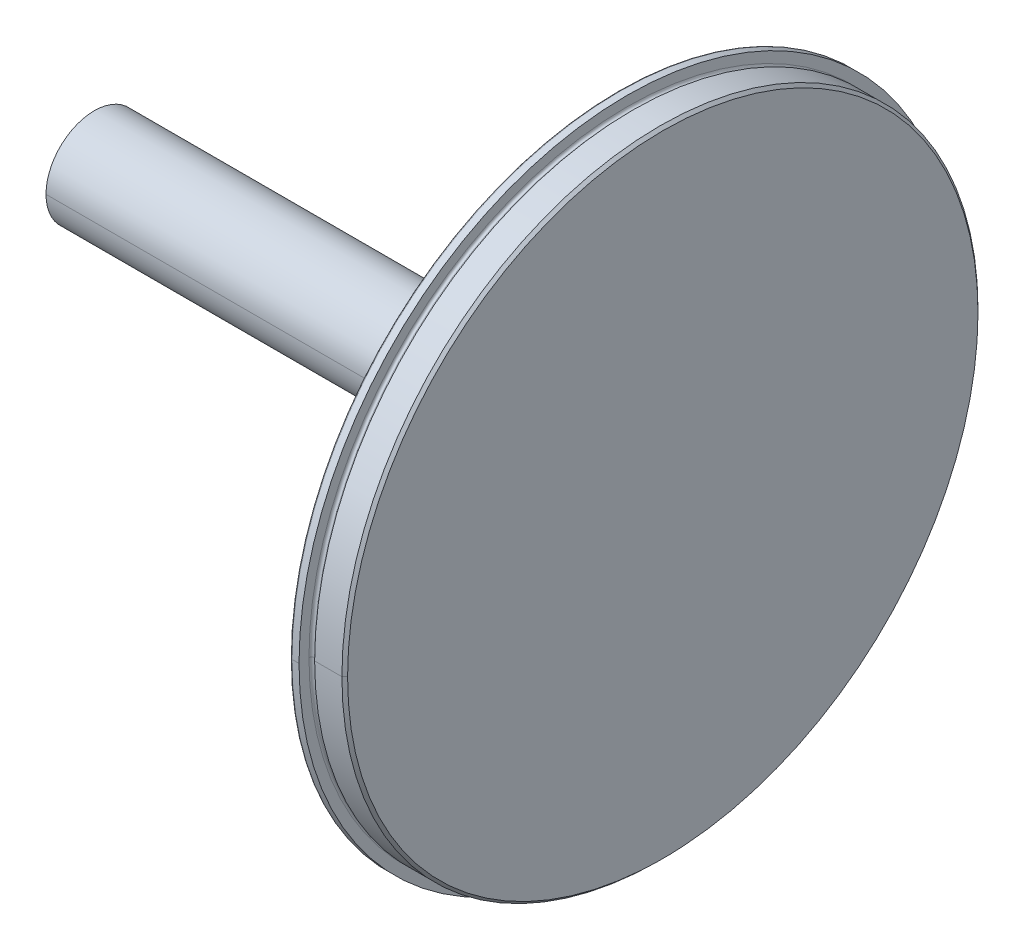
ISO-10303-21;
HEADER;
FILE_DESCRIPTION(('STEP AP214'),'2;1');
FILE_NAME('part.step','',(''),(''),'','','');
FILE_SCHEMA(('AUTOMOTIVE_DESIGN { 1 0 10303 214 1 1 1 1 }'));
ENDSEC;
DATA;
#1=APPLICATION_CONTEXT('core data for automotive mechanical design processes');
#2=APPLICATION_PROTOCOL_DEFINITION('international standard','automotive_design',2000,#1);
#3=PRODUCT_CONTEXT('',#1,'mechanical');
#4=PRODUCT('Part','Part','',(#3));
#5=PRODUCT_RELATED_PRODUCT_CATEGORY('part','',(#4));
#6=PRODUCT_DEFINITION_FORMATION('','',#4);
#7=PRODUCT_DEFINITION_CONTEXT('part definition',#1,'design');
#8=PRODUCT_DEFINITION('design','',#6,#7);
#9=PRODUCT_DEFINITION_SHAPE('','',#8);
#10=(LENGTH_UNIT() NAMED_UNIT(*) SI_UNIT(.MILLI.,.METRE.));
#11=(NAMED_UNIT(*) PLANE_ANGLE_UNIT() SI_UNIT($,.RADIAN.));
#12=(NAMED_UNIT(*) SI_UNIT($,.STERADIAN.) SOLID_ANGLE_UNIT());
#13=UNCERTAINTY_MEASURE_WITH_UNIT(LENGTH_MEASURE(1.E-05),#10,'distance_accuracy_value','');
#14=(GEOMETRIC_REPRESENTATION_CONTEXT(3) GLOBAL_UNCERTAINTY_ASSIGNED_CONTEXT((#13)) GLOBAL_UNIT_ASSIGNED_CONTEXT((#10,
#11,#12)) REPRESENTATION_CONTEXT('',''));
#15=CARTESIAN_POINT('',(0.,0.,0.));
#16=DIRECTION('',(0.,0.,1.));
#17=DIRECTION('',(1.,0.,0.));
#18=AXIS2_PLACEMENT_3D('',#15,#16,#17);
#19=CARTESIAN_POINT('',(-87.6,7.99999999999699,0.));
#20=DIRECTION('',(-1.,0.,0.));
#21=DIRECTION('',(0.,0.,1.));
#22=AXIS2_PLACEMENT_3D('',#19,#20,#21);
#23=PLANE('',#22);
#24=CARTESIAN_POINT('',(-87.6,0.,0.));
#25=DIRECTION('',(1.,0.,0.));
#26=DIRECTION('',(0.,0.,-1.));
#27=AXIS2_PLACEMENT_3D('',#24,#25,#26);
#28=CIRCLE('',#27,8.49999999999725);
#29=CARTESIAN_POINT('',(-87.6,0.,8.49999999999725));
#30=VERTEX_POINT('',#29);
#31=CARTESIAN_POINT('',(-87.6,0.,-8.49999999999725));
#32=VERTEX_POINT('',#31);
#33=EDGE_CURVE('E19',#30,#32,#28,.T.);
#34=ORIENTED_EDGE('',*,*,#33,.F.);
#35=CARTESIAN_POINT('',(-87.6,0.,0.));
#36=DIRECTION('',(1.,0.,0.));
#37=DIRECTION('',(0.,0.,-1.));
#38=AXIS2_PLACEMENT_3D('',#35,#36,#37);
#39=CIRCLE('',#38,8.49999999999725);
#40=EDGE_CURVE('E131',#32,#30,#39,.T.);
#41=ORIENTED_EDGE('',*,*,#40,.F.);
#42=EDGE_LOOP('',(#34,#41));
#43=FACE_BOUND('',#42,.T.);
#44=ADVANCED_FACE('F16',(#43),#23,.T.);
#45=CARTESIAN_POINT('',(0.,0.,0.));
#46=DIRECTION('',(1.,0.,0.));
#47=DIRECTION('',(0.,0.,-1.));
#48=AXIS2_PLACEMENT_3D('',#45,#46,#47);
#49=CYLINDRICAL_SURFACE('',#48,8.49999999999725);
#50=DIRECTION('',(1.,0.,0.));
#51=VECTOR('',#50,1.);
#52=CARTESIAN_POINT('',(0.,0.,-8.49999999999725));
#53=LINE('',#52,#51);
#54=CARTESIAN_POINT('',(-2.8,0.,-8.49999999999725));
#55=VERTEX_POINT('',#54);
#56=EDGE_CURVE('E139',#55,#32,#53,.F.);
#57=ORIENTED_EDGE('',*,*,#56,.F.);
#58=CARTESIAN_POINT('',(-2.8,0.,0.));
#59=DIRECTION('',(1.,0.,0.));
#60=DIRECTION('',(0.,0.,-1.));
#61=AXIS2_PLACEMENT_3D('',#58,#59,#60);
#62=CIRCLE('',#61,8.49999999999725);
#63=CARTESIAN_POINT('',(-2.8,0.,8.49999999999725));
#64=VERTEX_POINT('',#63);
#65=EDGE_CURVE('E146',#55,#64,#62,.F.);
#66=ORIENTED_EDGE('',*,*,#65,.T.);
#67=DIRECTION('',(1.,0.,0.));
#68=VECTOR('',#67,1.);
#69=CARTESIAN_POINT('',(0.,0.,8.49999999999725));
#70=LINE('',#69,#68);
#71=EDGE_CURVE('E141',#30,#64,#70,.T.);
#72=ORIENTED_EDGE('',*,*,#71,.F.);
#73=ORIENTED_EDGE('',*,*,#33,.T.);
#74=EDGE_LOOP('',(#57,#66,#72,#73));
#75=FACE_BOUND('',#74,.T.);
#76=ADVANCED_FACE('F137',(#75),#49,.T.);
#77=CARTESIAN_POINT('',(0.,0.,0.));
#78=DIRECTION('',(1.,0.,0.));
#79=DIRECTION('',(0.,0.,-1.));
#80=AXIS2_PLACEMENT_3D('',#77,#78,#79);
#81=CYLINDRICAL_SURFACE('',#80,8.49999999999725);
#82=CARTESIAN_POINT('',(-2.8,0.,0.));
#83=DIRECTION('',(1.,0.,0.));
#84=DIRECTION('',(0.,0.,-1.));
#85=AXIS2_PLACEMENT_3D('',#82,#83,#84);
#86=CIRCLE('',#85,8.49999999999725);
#87=EDGE_CURVE('E145',#64,#55,#86,.F.);
#88=ORIENTED_EDGE('',*,*,#87,.T.);
#89=ORIENTED_EDGE('',*,*,#56,.T.);
#90=ORIENTED_EDGE('',*,*,#40,.T.);
#91=ORIENTED_EDGE('',*,*,#71,.T.);
#92=EDGE_LOOP('',(#88,#89,#90,#91));
#93=FACE_BOUND('',#92,.T.);
#94=ADVANCED_FACE('F143',(#93),#81,.T.);
#95=CARTESIAN_POINT('',(-2.80000000000001,7.5,0.));
#96=DIRECTION('',(1.,0.,0.));
#97=DIRECTION('',(0.,0.,-1.));
#98=AXIS2_PLACEMENT_3D('',#95,#96,#97);
#99=PLANE('',#98);
#100=CARTESIAN_POINT('',(-2.8,0.,0.));
#101=DIRECTION('',(1.,0.,0.));
#102=DIRECTION('',(0.,0.,-1.));
#103=AXIS2_PLACEMENT_3D('',#100,#101,#102);
#104=CIRCLE('',#103,9.72702232430034);
#105=CARTESIAN_POINT('',(-2.8,0.,-9.72702232430034));
#106=VERTEX_POINT('',#105);
#107=CARTESIAN_POINT('',(-2.8,0.,9.72702232430034));
#108=VERTEX_POINT('',#107);
#109=EDGE_CURVE('E154',#106,#108,#104,.T.);
#110=ORIENTED_EDGE('',*,*,#109,.F.);
#111=CARTESIAN_POINT('',(-2.8,0.,0.));
#112=DIRECTION('',(1.,0.,0.));
#113=DIRECTION('',(0.,0.,-1.));
#114=AXIS2_PLACEMENT_3D('',#111,#112,#113);
#115=CIRCLE('',#114,9.72702232430034);
#116=EDGE_CURVE('E152',#108,#106,#115,.T.);
#117=ORIENTED_EDGE('',*,*,#116,.F.);
#118=EDGE_LOOP('',(#110,#117));
#119=FACE_BOUND('',#118,.T.);
#120=ORIENTED_EDGE('',*,*,#65,.F.);
#121=ORIENTED_EDGE('',*,*,#87,.F.);
#122=EDGE_LOOP('',(#120,#121));
#123=FACE_BOUND('',#122,.T.);
#124=ADVANCED_FACE('F575',(#119,#123),#99,.F.);
#125=CARTESIAN_POINT('',(-2.04999999999998,0.,0.));
#126=DIRECTION('',(1.,0.,0.));
#127=DIRECTION('',(0.,0.,-1.));
#128=AXIS2_PLACEMENT_3D('',#125,#126,#127);
#129=CONICAL_SURFACE('',#128,10.,0.349065850398866);
#130=DIRECTION('',(-0.939692620785908,0.,0.342020143325669));
#131=VECTOR('',#130,1.);
#132=CARTESIAN_POINT('',(-2.80000000000001,0.,-9.72702232430034));
#133=LINE('',#132,#131);
#134=CARTESIAN_POINT('',(-2.04999999999997,0.,-10.));
#135=VERTEX_POINT('',#134);
#136=EDGE_CURVE('E287',#135,#106,#133,.T.);
#137=ORIENTED_EDGE('',*,*,#136,.F.);
#138=CARTESIAN_POINT('',(-2.04999999999997,0.,0.));
#139=DIRECTION('',(-1.,0.,0.));
#140=DIRECTION('',(0.,0.,1.));
#141=AXIS2_PLACEMENT_3D('',#138,#139,#140);
#142=CIRCLE('',#141,10.);
#143=CARTESIAN_POINT('',(-2.04999999999997,0.,10.));
#144=VERTEX_POINT('',#143);
#145=EDGE_CURVE('E290',#144,#135,#142,.F.);
#146=ORIENTED_EDGE('',*,*,#145,.F.);
#147=DIRECTION('',(-0.939692620785908,0.,-0.342020143325669));
#148=VECTOR('',#147,1.);
#149=CARTESIAN_POINT('',(-2.80000000000001,0.,9.72702232430034));
#150=LINE('',#149,#148);
#151=EDGE_CURVE('E156',#108,#144,#150,.F.);
#152=ORIENTED_EDGE('',*,*,#151,.F.);
#153=ORIENTED_EDGE('',*,*,#116,.T.);
#154=EDGE_LOOP('',(#137,#146,#152,#153));
#155=FACE_BOUND('',#154,.T.);
#156=ADVANCED_FACE('F531',(#155),#129,.T.);
#157=CARTESIAN_POINT('',(-2.04999999999998,0.,0.));
#158=DIRECTION('',(1.,0.,0.));
#159=DIRECTION('',(0.,0.,-1.));
#160=AXIS2_PLACEMENT_3D('',#157,#158,#159);
#161=CONICAL_SURFACE('',#160,10.,0.349065850398866);
#162=CARTESIAN_POINT('',(-2.04999999999997,0.,0.));
#163=DIRECTION('',(-1.,0.,0.));
#164=DIRECTION('',(0.,0.,1.));
#165=AXIS2_PLACEMENT_3D('',#162,#163,#164);
#166=CIRCLE('',#165,10.);
#167=EDGE_CURVE('E297',#135,#144,#166,.F.);
#168=ORIENTED_EDGE('',*,*,#167,.F.);
#169=ORIENTED_EDGE('',*,*,#136,.T.);
#170=ORIENTED_EDGE('',*,*,#109,.T.);
#171=ORIENTED_EDGE('',*,*,#151,.T.);
#172=EDGE_LOOP('',(#168,#169,#170,#171));
#173=FACE_BOUND('',#172,.T.);
#174=ADVANCED_FACE('F523',(#173),#161,.T.);
#175=CARTESIAN_POINT('',(0.,0.,0.));
#176=DIRECTION('',(-1.,0.,0.));
#177=DIRECTION('',(0.,0.,1.));
#178=AXIS2_PLACEMENT_3D('',#175,#176,#177);
#179=CYLINDRICAL_SURFACE('',#178,10.);
#180=DIRECTION('',(-1.,0.,0.));
#181=VECTOR('',#180,1.);
#182=CARTESIAN_POINT('',(0.,0.,10.));
#183=LINE('',#182,#181);
#184=CARTESIAN_POINT('',(1.19999999999999,0.,10.));
#185=VERTEX_POINT('',#184);
#186=EDGE_CURVE('E160',#144,#185,#183,.F.);
#187=ORIENTED_EDGE('',*,*,#186,.F.);
#188=ORIENTED_EDGE('',*,*,#145,.T.);
#189=DIRECTION('',(-1.,0.,0.));
#190=VECTOR('',#189,1.);
#191=CARTESIAN_POINT('',(0.,0.,-10.));
#192=LINE('',#191,#190);
#193=CARTESIAN_POINT('',(1.19999999999999,0.,-10.));
#194=VERTEX_POINT('',#193);
#195=EDGE_CURVE('E300',#194,#135,#192,.T.);
#196=ORIENTED_EDGE('',*,*,#195,.F.);
#197=CARTESIAN_POINT('',(1.19999999999999,0.,0.));
#198=DIRECTION('',(-1.,0.,0.));
#199=DIRECTION('',(0.,0.,1.));
#200=AXIS2_PLACEMENT_3D('',#197,#198,#199);
#201=CIRCLE('',#200,10.);
#202=EDGE_CURVE('E157',#185,#194,#201,.F.);
#203=ORIENTED_EDGE('',*,*,#202,.F.);
#204=EDGE_LOOP('',(#187,#188,#196,#203));
#205=FACE_BOUND('',#204,.T.);
#206=ADVANCED_FACE('F533',(#205),#179,.T.);
#207=CARTESIAN_POINT('',(0.,0.,0.));
#208=DIRECTION('',(-1.,0.,0.));
#209=DIRECTION('',(0.,0.,1.));
#210=AXIS2_PLACEMENT_3D('',#207,#208,#209);
#211=CYLINDRICAL_SURFACE('',#210,10.);
#212=ORIENTED_EDGE('',*,*,#167,.T.);
#213=ORIENTED_EDGE('',*,*,#186,.T.);
#214=CARTESIAN_POINT('',(1.19999999999999,0.,0.));
#215=DIRECTION('',(-1.,0.,0.));
#216=DIRECTION('',(0.,0.,1.));
#217=AXIS2_PLACEMENT_3D('',#214,#215,#216);
#218=CIRCLE('',#217,10.);
#219=EDGE_CURVE('E159',#194,#185,#218,.F.);
#220=ORIENTED_EDGE('',*,*,#219,.F.);
#221=ORIENTED_EDGE('',*,*,#195,.T.);
#222=EDGE_LOOP('',(#212,#213,#220,#221));
#223=FACE_BOUND('',#222,.T.);
#224=ADVANCED_FACE('F528',(#223),#211,.T.);
#225=CARTESIAN_POINT('',(1.19999999999999,-11.1,0.));
#226=DIRECTION('',(1.,0.,0.));
#227=DIRECTION('',(0.,0.,-1.));
#228=AXIS2_PLACEMENT_3D('',#225,#226,#227);
#229=PLANE('',#228);
#230=ORIENTED_EDGE('',*,*,#202,.T.);
#231=ORIENTED_EDGE('',*,*,#219,.T.);
#232=EDGE_LOOP('',(#230,#231));
#233=FACE_BOUND('',#232,.T.);
#234=CARTESIAN_POINT('',(1.19999999999999,0.,0.));
#235=DIRECTION('',(1.,0.,0.));
#236=DIRECTION('',(0.,0.,-1.));
#237=AXIS2_PLACEMENT_3D('',#234,#235,#236);
#238=CIRCLE('',#237,9.1);
#239=CARTESIAN_POINT('',(1.19999999999999,0.,-9.1));
#240=VERTEX_POINT('',#239);
#241=CARTESIAN_POINT('',(1.19999999999999,0.,9.1));
#242=VERTEX_POINT('',#241);
#243=EDGE_CURVE('E163',#240,#242,#238,.T.);
#244=ORIENTED_EDGE('',*,*,#243,.F.);
#245=CARTESIAN_POINT('',(1.19999999999999,0.,0.));
#246=DIRECTION('',(1.,0.,0.));
#247=DIRECTION('',(0.,0.,-1.));
#248=AXIS2_PLACEMENT_3D('',#245,#246,#247);
#249=CIRCLE('',#248,9.1);
#250=EDGE_CURVE('E166',#242,#240,#249,.T.);
#251=ORIENTED_EDGE('',*,*,#250,.F.);
#252=EDGE_LOOP('',(#244,#251));
#253=FACE_BOUND('',#252,.T.);
#254=ADVANCED_FACE('F535',(#233,#253),#229,.T.);
#255=CARTESIAN_POINT('',(0.,0.,0.));
#256=DIRECTION('',(1.,0.,0.));
#257=DIRECTION('',(0.,0.,-1.));
#258=AXIS2_PLACEMENT_3D('',#255,#256,#257);
#259=CYLINDRICAL_SURFACE('',#258,9.1);
#260=CARTESIAN_POINT('',(2.49999999999999,0.,0.));
#261=DIRECTION('',(1.,0.,0.));
#262=DIRECTION('',(0.,0.,-1.));
#263=AXIS2_PLACEMENT_3D('',#260,#261,#262);
#264=CIRCLE('',#263,9.1);
#265=CARTESIAN_POINT('',(2.49999999999999,0.,-9.1));
#266=VERTEX_POINT('',#265);
#267=CARTESIAN_POINT('',(2.49999999999999,0.,9.1));
#268=VERTEX_POINT('',#267);
#269=EDGE_CURVE('E169',#266,#268,#264,.T.);
#270=ORIENTED_EDGE('',*,*,#269,.F.);
#271=DIRECTION('',(1.,0.,0.));
#272=VECTOR('',#271,1.);
#273=CARTESIAN_POINT('',(0.,0.,-9.1));
#274=LINE('',#273,#272);
#275=EDGE_CURVE('E168',#240,#266,#274,.T.);
#276=ORIENTED_EDGE('',*,*,#275,.F.);
#277=ORIENTED_EDGE('',*,*,#243,.T.);
#278=DIRECTION('',(1.,0.,0.));
#279=VECTOR('',#278,1.);
#280=CARTESIAN_POINT('',(0.,0.,9.1));
#281=LINE('',#280,#279);
#282=EDGE_CURVE('E165',#268,#242,#281,.F.);
#283=ORIENTED_EDGE('',*,*,#282,.F.);
#284=EDGE_LOOP('',(#270,#276,#277,#283));
#285=FACE_BOUND('',#284,.T.);
#286=ADVANCED_FACE('F538',(#285),#259,.T.);
#287=CARTESIAN_POINT('',(0.,0.,0.));
#288=DIRECTION('',(1.,0.,0.));
#289=DIRECTION('',(0.,0.,-1.));
#290=AXIS2_PLACEMENT_3D('',#287,#288,#289);
#291=CYLINDRICAL_SURFACE('',#290,9.1);
#292=ORIENTED_EDGE('',*,*,#275,.T.);
#293=CARTESIAN_POINT('',(2.49999999999999,0.,0.));
#294=DIRECTION('',(1.,0.,0.));
#295=DIRECTION('',(0.,0.,-1.));
#296=AXIS2_PLACEMENT_3D('',#293,#294,#295);
#297=CIRCLE('',#296,9.1);
#298=EDGE_CURVE('E171',#268,#266,#297,.T.);
#299=ORIENTED_EDGE('',*,*,#298,.F.);
#300=ORIENTED_EDGE('',*,*,#282,.T.);
#301=ORIENTED_EDGE('',*,*,#250,.T.);
#302=EDGE_LOOP('',(#292,#299,#300,#301));
#303=FACE_BOUND('',#302,.T.);
#304=ADVANCED_FACE('F548',(#303),#291,.T.);
#305=CARTESIAN_POINT('',(2.49999999999999,-11.1,0.));
#306=DIRECTION('',(-1.,0.,0.));
#307=DIRECTION('',(0.,0.,1.));
#308=AXIS2_PLACEMENT_3D('',#305,#306,#307);
#309=PLANE('',#308);
#310=CARTESIAN_POINT('',(2.49999999999999,0.,0.));
#311=DIRECTION('',(-1.,0.,0.));
#312=DIRECTION('',(0.,0.,1.));
#313=AXIS2_PLACEMENT_3D('',#310,#311,#312);
#314=CIRCLE('',#313,10.);
#315=CARTESIAN_POINT('',(2.49999999999999,0.,-10.));
#316=VERTEX_POINT('',#315);
#317=CARTESIAN_POINT('',(2.49999999999999,0.,10.));
#318=VERTEX_POINT('',#317);
#319=EDGE_CURVE('E174',#316,#318,#314,.F.);
#320=ORIENTED_EDGE('',*,*,#319,.F.);
#321=CARTESIAN_POINT('',(2.49999999999999,0.,0.));
#322=DIRECTION('',(-1.,0.,0.));
#323=DIRECTION('',(0.,0.,1.));
#324=AXIS2_PLACEMENT_3D('',#321,#322,#323);
#325=CIRCLE('',#324,10.);
#326=EDGE_CURVE('E177',#318,#316,#325,.F.);
#327=ORIENTED_EDGE('',*,*,#326,.F.);
#328=EDGE_LOOP('',(#320,#327));
#329=FACE_BOUND('',#328,.T.);
#330=ORIENTED_EDGE('',*,*,#269,.T.);
#331=ORIENTED_EDGE('',*,*,#298,.T.);
#332=EDGE_LOOP('',(#330,#331));
#333=FACE_BOUND('',#332,.T.);
#334=ADVANCED_FACE('F550',(#329,#333),#309,.T.);
#335=CARTESIAN_POINT('',(0.,0.,0.));
#336=DIRECTION('',(-1.,0.,0.));
#337=DIRECTION('',(0.,0.,1.));
#338=AXIS2_PLACEMENT_3D('',#335,#336,#337);
#339=CYLINDRICAL_SURFACE('',#338,10.);
#340=ORIENTED_EDGE('',*,*,#319,.T.);
#341=DIRECTION('',(-1.,0.,0.));
#342=VECTOR('',#341,1.);
#343=CARTESIAN_POINT('',(0.,0.,10.));
#344=LINE('',#343,#342);
#345=CARTESIAN_POINT('',(3.7,0.,10.));
#346=VERTEX_POINT('',#345);
#347=EDGE_CURVE('E181',#346,#318,#344,.T.);
#348=ORIENTED_EDGE('',*,*,#347,.F.);
#349=CARTESIAN_POINT('',(3.7,0.,0.));
#350=DIRECTION('',(-1.,0.,0.));
#351=DIRECTION('',(0.,0.,1.));
#352=AXIS2_PLACEMENT_3D('',#349,#350,#351);
#353=CIRCLE('',#352,10.);
#354=CARTESIAN_POINT('',(3.7,0.,-10.));
#355=VERTEX_POINT('',#354);
#356=EDGE_CURVE('E180',#346,#355,#353,.T.);
#357=ORIENTED_EDGE('',*,*,#356,.T.);
#358=DIRECTION('',(-1.,0.,0.));
#359=VECTOR('',#358,1.);
#360=CARTESIAN_POINT('',(0.,0.,-10.));
#361=LINE('',#360,#359);
#362=EDGE_CURVE('E176',#316,#355,#361,.F.);
#363=ORIENTED_EDGE('',*,*,#362,.F.);
#364=EDGE_LOOP('',(#340,#348,#357,#363));
#365=FACE_BOUND('',#364,.T.);
#366=ADVANCED_FACE('F552',(#365),#339,.T.);
#367=CARTESIAN_POINT('',(0.,0.,0.));
#368=DIRECTION('',(-1.,0.,0.));
#369=DIRECTION('',(0.,0.,1.));
#370=AXIS2_PLACEMENT_3D('',#367,#368,#369);
#371=CYLINDRICAL_SURFACE('',#370,10.);
#372=ORIENTED_EDGE('',*,*,#347,.T.);
#373=ORIENTED_EDGE('',*,*,#326,.T.);
#374=ORIENTED_EDGE('',*,*,#362,.T.);
#375=CARTESIAN_POINT('',(3.7,0.,0.));
#376=DIRECTION('',(-1.,0.,0.));
#377=DIRECTION('',(0.,0.,1.));
#378=AXIS2_PLACEMENT_3D('',#375,#376,#377);
#379=CIRCLE('',#378,10.);
#380=EDGE_CURVE('E184',#355,#346,#379,.T.);
#381=ORIENTED_EDGE('',*,*,#380,.T.);
#382=EDGE_LOOP('',(#372,#373,#374,#381));
#383=FACE_BOUND('',#382,.T.);
#384=ADVANCED_FACE('F559',(#383),#371,.T.);
#385=CARTESIAN_POINT('',(3.7,42.5,0.));
#386=DIRECTION('',(1.,0.,0.));
#387=DIRECTION('',(0.,0.,-1.));
#388=AXIS2_PLACEMENT_3D('',#385,#386,#387);
#389=PLANE('',#388);
#390=CARTESIAN_POINT('',(3.70000000000001,0.,0.));
#391=DIRECTION('',(1.,0.,0.));
#392=DIRECTION('',(0.,0.,-1.));
#393=AXIS2_PLACEMENT_3D('',#390,#391,#392);
#394=CIRCLE('',#393,55.5);
#395=CARTESIAN_POINT('',(3.70000000000001,0.,-55.5));
#396=VERTEX_POINT('',#395);
#397=CARTESIAN_POINT('',(3.70000000000001,0.,55.5));
#398=VERTEX_POINT('',#397);
#399=EDGE_CURVE('E189',#396,#398,#394,.T.);
#400=ORIENTED_EDGE('',*,*,#399,.F.);
#401=CARTESIAN_POINT('',(3.70000000000001,0.,0.));
#402=DIRECTION('',(1.,0.,0.));
#403=DIRECTION('',(0.,0.,-1.));
#404=AXIS2_PLACEMENT_3D('',#401,#402,#403);
#405=CIRCLE('',#404,55.5);
#406=EDGE_CURVE('E187',#398,#396,#405,.T.);
#407=ORIENTED_EDGE('',*,*,#406,.F.);
#408=EDGE_LOOP('',(#400,#407));
#409=FACE_BOUND('',#408,.T.);
#410=ORIENTED_EDGE('',*,*,#356,.F.);
#411=ORIENTED_EDGE('',*,*,#380,.F.);
#412=EDGE_LOOP('',(#410,#411));
#413=FACE_BOUND('',#412,.T.);
#414=ADVANCED_FACE('F699',(#409,#413),#389,.F.);
#415=CARTESIAN_POINT('',(-153.277705423413,0.,0.));
#416=DIRECTION('',(1.,0.,0.));
#417=DIRECTION('',(0.,0.,-1.));
#418=AXIS2_PLACEMENT_3D('',#415,#416,#417);
#419=CYLINDRICAL_SURFACE('',#418,55.5);
#420=DIRECTION('',(1.,0.,0.));
#421=VECTOR('',#420,1.);
#422=CARTESIAN_POINT('',(-153.277705423413,0.,-55.5));
#423=LINE('',#422,#421);
#424=CARTESIAN_POINT('',(4.93647409165924,0.,-55.5));
#425=VERTEX_POINT('',#424);
#426=EDGE_CURVE('E322',#425,#396,#423,.F.);
#427=ORIENTED_EDGE('',*,*,#426,.F.);
#428=CARTESIAN_POINT('',(4.93647409165924,0.,0.));
#429=DIRECTION('',(-1.,0.,0.));
#430=DIRECTION('',(0.,0.,1.));
#431=AXIS2_PLACEMENT_3D('',#428,#429,#430);
#432=CIRCLE('',#431,55.5);
#433=CARTESIAN_POINT('',(4.93647409165924,0.,55.5));
#434=VERTEX_POINT('',#433);
#435=EDGE_CURVE('E327',#425,#434,#432,.T.);
#436=ORIENTED_EDGE('',*,*,#435,.T.);
#437=DIRECTION('',(1.,0.,0.));
#438=VECTOR('',#437,1.);
#439=CARTESIAN_POINT('',(-153.277705423413,0.,55.5));
#440=LINE('',#439,#438);
#441=EDGE_CURVE('E191',#398,#434,#440,.T.);
#442=ORIENTED_EDGE('',*,*,#441,.F.);
#443=ORIENTED_EDGE('',*,*,#406,.T.);
#444=EDGE_LOOP('',(#427,#436,#442,#443));
#445=FACE_BOUND('',#444,.T.);
#446=ADVANCED_FACE('F708',(#445),#419,.T.);
#447=CARTESIAN_POINT('',(-153.277705423413,0.,0.));
#448=DIRECTION('',(1.,0.,0.));
#449=DIRECTION('',(0.,0.,-1.));
#450=AXIS2_PLACEMENT_3D('',#447,#448,#449);
#451=CYLINDRICAL_SURFACE('',#450,55.5);
#452=CARTESIAN_POINT('',(4.93647409165924,0.,0.));
#453=DIRECTION('',(-1.,0.,0.));
#454=DIRECTION('',(0.,0.,1.));
#455=AXIS2_PLACEMENT_3D('',#452,#453,#454);
#456=CIRCLE('',#455,55.5);
#457=EDGE_CURVE('E330',#434,#425,#456,.T.);
#458=ORIENTED_EDGE('',*,*,#457,.T.);
#459=ORIENTED_EDGE('',*,*,#426,.T.);
#460=ORIENTED_EDGE('',*,*,#399,.T.);
#461=ORIENTED_EDGE('',*,*,#441,.T.);
#462=EDGE_LOOP('',(#458,#459,#460,#461));
#463=FACE_BOUND('',#462,.T.);
#464=ADVANCED_FACE('F718',(#463),#451,.T.);
#465=CARTESIAN_POINT('',(4.71157076231294,0.,0.));
#466=DIRECTION('',(-1.,0.,0.));
#467=DIRECTION('',(0.,0.,1.));
#468=AXIS2_PLACEMENT_3D('',#465,#466,#467);
#469=CONICAL_SURFACE('',#468,56.2133022303889,1.2653637076959);
#470=DIRECTION('',(0.300705799504265,0.,0.953716950748229));
#471=VECTOR('',#470,1.);
#472=CARTESIAN_POINT('',(4.7,0.,-56.25));
#473=LINE('',#472,#471);
#474=CARTESIAN_POINT('',(4.71157076231294,0.,-56.2133022303889));
#475=VERTEX_POINT('',#474);
#476=EDGE_CURVE('E333',#425,#475,#473,.F.);
#477=ORIENTED_EDGE('',*,*,#476,.T.);
#478=CARTESIAN_POINT('',(4.71157076231294,0.,0.));
#479=DIRECTION('',(1.,0.,0.));
#480=DIRECTION('',(0.,0.,-1.));
#481=AXIS2_PLACEMENT_3D('',#478,#479,#480);
#482=CIRCLE('',#481,56.2133022303889);
#483=CARTESIAN_POINT('',(4.71157076231294,0.,56.2133022303889));
#484=VERTEX_POINT('',#483);
#485=EDGE_CURVE('E347',#484,#475,#482,.T.);
#486=ORIENTED_EDGE('',*,*,#485,.F.);
#487=DIRECTION('',(0.300705799504265,0.,-0.953716950748229));
#488=VECTOR('',#487,1.);
#489=CARTESIAN_POINT('',(4.7,0.,56.25));
#490=LINE('',#489,#488);
#491=EDGE_CURVE('E334',#484,#434,#490,.T.);
#492=ORIENTED_EDGE('',*,*,#491,.T.);
#493=ORIENTED_EDGE('',*,*,#435,.F.);
#494=EDGE_LOOP('',(#477,#486,#492,#493));
#495=FACE_BOUND('',#494,.T.);
#496=ADVANCED_FACE('F728',(#495),#469,.F.);
#497=CARTESIAN_POINT('',(4.71157076231294,0.,0.));
#498=DIRECTION('',(-1.,0.,0.));
#499=DIRECTION('',(0.,0.,1.));
#500=AXIS2_PLACEMENT_3D('',#497,#498,#499);
#501=CONICAL_SURFACE('',#500,56.2133022303889,1.2653637076959);
#502=ORIENTED_EDGE('',*,*,#457,.F.);
#503=ORIENTED_EDGE('',*,*,#491,.F.);
#504=CARTESIAN_POINT('',(4.71157076231294,0.,0.));
#505=DIRECTION('',(1.,0.,0.));
#506=DIRECTION('',(0.,0.,-1.));
#507=AXIS2_PLACEMENT_3D('',#504,#505,#506);
#508=CIRCLE('',#507,56.2133022303889);
#509=EDGE_CURVE('E350',#475,#484,#508,.T.);
#510=ORIENTED_EDGE('',*,*,#509,.F.);
#511=ORIENTED_EDGE('',*,*,#476,.F.);
#512=EDGE_LOOP('',(#502,#503,#510,#511));
#513=FACE_BOUND('',#512,.T.);
#514=ADVANCED_FACE('F375',(#513),#501,.F.);
#515=CARTESIAN_POINT('',(4.95,0.,0.));
#516=DIRECTION('',(1.,0.,0.));
#517=DIRECTION('',(0.,0.,-1.));
#518=AXIS2_PLACEMENT_3D('',#515,#516,#517);
#519=TOROIDAL_SURFACE('',#518,56.288478680265,0.25);
#520=CARTESIAN_POINT('',(4.95,0.,-56.288478680265));
#521=DIRECTION('',(0.,1.,0.));
#522=DIRECTION('',(0.,0.,-1.));
#523=AXIS2_PLACEMENT_3D('',#520,#521,#522);
#524=CIRCLE('',#523,0.25);
#525=CARTESIAN_POINT('',(4.7,0.,-56.288478680265));
#526=VERTEX_POINT('',#525);
#527=EDGE_CURVE('E385',#526,#475,#524,.T.);
#528=ORIENTED_EDGE('',*,*,#527,.F.);
#529=CARTESIAN_POINT('',(4.7,0.,0.));
#530=DIRECTION('',(-1.,0.,0.));
#531=DIRECTION('',(0.,0.,-1.));
#532=AXIS2_PLACEMENT_3D('',#529,#530,#531);
#533=CIRCLE('',#532,56.288478680265);
#534=CARTESIAN_POINT('',(4.7,0.,56.288478680265));
#535=VERTEX_POINT('',#534);
#536=EDGE_CURVE('E388',#526,#535,#533,.T.);
#537=ORIENTED_EDGE('',*,*,#536,.T.);
#538=CARTESIAN_POINT('',(4.95,0.,56.288478680265));
#539=DIRECTION('',(0.,-1.,0.));
#540=DIRECTION('',(0.,0.,1.));
#541=AXIS2_PLACEMENT_3D('',#538,#539,#540);
#542=CIRCLE('',#541,0.25);
#543=EDGE_CURVE('E353',#484,#535,#542,.F.);
#544=ORIENTED_EDGE('',*,*,#543,.F.);
#545=ORIENTED_EDGE('',*,*,#485,.T.);
#546=EDGE_LOOP('',(#528,#537,#544,#545));
#547=FACE_BOUND('',#546,.T.);
#548=ADVANCED_FACE('F364',(#547),#519,.T.);
#549=CARTESIAN_POINT('',(4.95,0.,0.));
#550=DIRECTION('',(1.,0.,0.));
#551=DIRECTION('',(0.,0.,-1.));
#552=AXIS2_PLACEMENT_3D('',#549,#550,#551);
#553=TOROIDAL_SURFACE('',#552,56.288478680265,0.25);
#554=CARTESIAN_POINT('',(4.7,0.,0.));
#555=DIRECTION('',(-1.,0.,0.));
#556=DIRECTION('',(0.,0.,1.));
#557=AXIS2_PLACEMENT_3D('',#554,#555,#556);
#558=CIRCLE('',#557,56.288478680265);
#559=EDGE_CURVE('E405',#535,#526,#558,.T.);
#560=ORIENTED_EDGE('',*,*,#559,.T.);
#561=ORIENTED_EDGE('',*,*,#527,.T.);
#562=ORIENTED_EDGE('',*,*,#509,.T.);
#563=ORIENTED_EDGE('',*,*,#543,.T.);
#564=EDGE_LOOP('',(#560,#561,#562,#563));
#565=FACE_BOUND('',#564,.T.);
#566=ADVANCED_FACE('F374',(#565),#553,.T.);
#567=CARTESIAN_POINT('',(4.7,56.25,0.));
#568=DIRECTION('',(1.,0.,0.));
#569=DIRECTION('',(0.,0.,-1.));
#570=AXIS2_PLACEMENT_3D('',#567,#568,#569);
#571=PLANE('',#570);
#572=CARTESIAN_POINT('',(4.7,0.,0.));
#573=DIRECTION('',(1.,0.,0.));
#574=DIRECTION('',(0.,0.,-1.));
#575=AXIS2_PLACEMENT_3D('',#572,#573,#574);
#576=CIRCLE('',#575,57.5);
#577=CARTESIAN_POINT('',(4.7,0.,-57.5));
#578=VERTEX_POINT('',#577);
#579=CARTESIAN_POINT('',(4.7,0.,57.5));
#580=VERTEX_POINT('',#579);
#581=EDGE_CURVE('E464',#578,#580,#576,.T.);
#582=ORIENTED_EDGE('',*,*,#581,.F.);
#583=CARTESIAN_POINT('',(4.7,0.,0.));
#584=DIRECTION('',(1.,0.,0.));
#585=DIRECTION('',(0.,0.,1.));
#586=AXIS2_PLACEMENT_3D('',#583,#584,#585);
#587=CIRCLE('',#586,57.5);
#588=EDGE_CURVE('E475',#580,#578,#587,.T.);
#589=ORIENTED_EDGE('',*,*,#588,.F.);
#590=EDGE_LOOP('',(#582,#589));
#591=FACE_BOUND('',#590,.T.);
#592=ORIENTED_EDGE('',*,*,#536,.F.);
#593=ORIENTED_EDGE('',*,*,#559,.F.);
#594=EDGE_LOOP('',(#592,#593));
#595=FACE_BOUND('',#594,.T.);
#596=ADVANCED_FACE('F425',(#591,#595),#571,.F.);
#597=CARTESIAN_POINT('',(4.95,0.,0.));
#598=DIRECTION('',(1.,0.,0.));
#599=DIRECTION('',(0.,0.,-1.));
#600=AXIS2_PLACEMENT_3D('',#597,#598,#599);
#601=TOROIDAL_SURFACE('',#600,57.5,0.25);
#602=CARTESIAN_POINT('',(4.95,0.,-57.5));
#603=DIRECTION('',(0.,1.,0.));
#604=DIRECTION('',(0.,0.,-1.));
#605=AXIS2_PLACEMENT_3D('',#602,#603,#604);
#606=CIRCLE('',#605,0.25);
#607=CARTESIAN_POINT('',(4.95,0.,-57.75));
#608=VERTEX_POINT('',#607);
#609=EDGE_CURVE('E499',#608,#578,#606,.T.);
#610=ORIENTED_EDGE('',*,*,#609,.F.);
#611=CARTESIAN_POINT('',(4.95,0.,0.));
#612=DIRECTION('',(-1.,0.,0.));
#613=DIRECTION('',(0.,0.,1.));
#614=AXIS2_PLACEMENT_3D('',#611,#612,#613);
#615=CIRCLE('',#614,57.75);
#616=CARTESIAN_POINT('',(4.95,0.,57.75));
#617=VERTEX_POINT('',#616);
#618=EDGE_CURVE('E1005',#617,#608,#615,.F.);
#619=ORIENTED_EDGE('',*,*,#618,.F.);
#620=CARTESIAN_POINT('',(4.95,0.,57.5));
#621=DIRECTION('',(0.,-1.,0.));
#622=DIRECTION('',(0.,0.,1.));
#623=AXIS2_PLACEMENT_3D('',#620,#621,#622);
#624=CIRCLE('',#623,0.25);
#625=EDGE_CURVE('E496',#580,#617,#624,.F.);
#626=ORIENTED_EDGE('',*,*,#625,.F.);
#627=ORIENTED_EDGE('',*,*,#588,.T.);
#628=EDGE_LOOP('',(#610,#619,#626,#627));
#629=FACE_BOUND('',#628,.T.);
#630=ADVANCED_FACE('F414',(#629),#601,.T.);
#631=CARTESIAN_POINT('',(4.95,0.,0.));
#632=DIRECTION('',(1.,0.,0.));
#633=DIRECTION('',(0.,0.,-1.));
#634=AXIS2_PLACEMENT_3D('',#631,#632,#633);
#635=TOROIDAL_SURFACE('',#634,57.5,0.25);
#636=CARTESIAN_POINT('',(4.95,0.,0.));
#637=DIRECTION('',(-1.,0.,0.));
#638=DIRECTION('',(0.,0.,1.));
#639=AXIS2_PLACEMENT_3D('',#636,#637,#638);
#640=CIRCLE('',#639,57.75);
#641=EDGE_CURVE('E999',#608,#617,#640,.F.);
#642=ORIENTED_EDGE('',*,*,#641,.F.);
#643=ORIENTED_EDGE('',*,*,#609,.T.);
#644=ORIENTED_EDGE('',*,*,#581,.T.);
#645=ORIENTED_EDGE('',*,*,#625,.T.);
#646=EDGE_LOOP('',(#642,#643,#644,#645));
#647=FACE_BOUND('',#646,.T.);
#648=ADVANCED_FACE('F424',(#647),#635,.T.);
#649=CARTESIAN_POINT('',(0.,0.,0.));
#650=DIRECTION('',(-1.,0.,0.));
#651=DIRECTION('',(0.,0.,1.));
#652=AXIS2_PLACEMENT_3D('',#649,#650,#651);
#653=CYLINDRICAL_SURFACE('',#652,57.75);
#654=DIRECTION('',(-1.,0.,0.));
#655=VECTOR('',#654,1.);
#656=CARTESIAN_POINT('',(0.,0.,57.75));
#657=LINE('',#656,#655);
#658=CARTESIAN_POINT('',(6.2,0.,57.75));
#659=VERTEX_POINT('',#658);
#660=EDGE_CURVE('E196',#617,#659,#657,.F.);
#661=ORIENTED_EDGE('',*,*,#660,.F.);
#662=ORIENTED_EDGE('',*,*,#618,.T.);
#663=DIRECTION('',(-1.,0.,0.));
#664=VECTOR('',#663,1.);
#665=CARTESIAN_POINT('',(0.,0.,-57.75));
#666=LINE('',#665,#664);
#667=CARTESIAN_POINT('',(6.2,0.,-57.75));
#668=VERTEX_POINT('',#667);
#669=EDGE_CURVE('E1002',#668,#608,#666,.T.);
#670=ORIENTED_EDGE('',*,*,#669,.F.);
#671=CARTESIAN_POINT('',(6.2,0.,0.));
#672=DIRECTION('',(-1.,0.,0.));
#673=DIRECTION('',(0.,0.,1.));
#674=AXIS2_PLACEMENT_3D('',#671,#672,#673);
#675=CIRCLE('',#674,57.75);
#676=EDGE_CURVE('E192',#668,#659,#675,.T.);
#677=ORIENTED_EDGE('',*,*,#676,.T.);
#678=EDGE_LOOP('',(#661,#662,#670,#677));
#679=FACE_BOUND('',#678,.T.);
#680=ADVANCED_FACE('F780',(#679),#653,.T.);
#681=CARTESIAN_POINT('',(0.,0.,0.));
#682=DIRECTION('',(-1.,0.,0.));
#683=DIRECTION('',(0.,0.,1.));
#684=AXIS2_PLACEMENT_3D('',#681,#682,#683);
#685=CYLINDRICAL_SURFACE('',#684,57.75);
#686=ORIENTED_EDGE('',*,*,#641,.T.);
#687=ORIENTED_EDGE('',*,*,#660,.T.);
#688=CARTESIAN_POINT('',(6.2,0.,0.));
#689=DIRECTION('',(-1.,0.,0.));
#690=DIRECTION('',(0.,0.,1.));
#691=AXIS2_PLACEMENT_3D('',#688,#689,#690);
#692=CIRCLE('',#691,57.75);
#693=EDGE_CURVE('E195',#659,#668,#692,.T.);
#694=ORIENTED_EDGE('',*,*,#693,.T.);
#695=ORIENTED_EDGE('',*,*,#669,.T.);
#696=EDGE_LOOP('',(#686,#687,#694,#695));
#697=FACE_BOUND('',#696,.T.);
#698=ADVANCED_FACE('F788',(#697),#685,.T.);
#699=CARTESIAN_POINT('',(6.2,57.75,0.));
#700=DIRECTION('',(-1.,0.,0.));
#701=DIRECTION('',(0.,0.,1.));
#702=AXIS2_PLACEMENT_3D('',#699,#700,#701);
#703=PLANE('',#702);
#704=CARTESIAN_POINT('',(6.2,0.,0.));
#705=DIRECTION('',(1.,0.,0.));
#706=DIRECTION('',(0.,0.,1.));
#707=AXIS2_PLACEMENT_3D('',#704,#705,#706);
#708=CIRCLE('',#707,56.);
#709=CARTESIAN_POINT('',(6.2,0.,-56.));
#710=VERTEX_POINT('',#709);
#711=CARTESIAN_POINT('',(6.2,0.,56.));
#712=VERTEX_POINT('',#711);
#713=EDGE_CURVE('E977',#710,#712,#708,.F.);
#714=ORIENTED_EDGE('',*,*,#713,.T.);
#715=CARTESIAN_POINT('',(6.2,0.,0.));
#716=DIRECTION('',(1.,0.,0.));
#717=DIRECTION('',(0.,0.,-1.));
#718=AXIS2_PLACEMENT_3D('',#715,#716,#717);
#719=CIRCLE('',#718,56.);
#720=EDGE_CURVE('E199',#712,#710,#719,.F.);
#721=ORIENTED_EDGE('',*,*,#720,.T.);
#722=EDGE_LOOP('',(#714,#721));
#723=FACE_BOUND('',#722,.T.);
#724=ORIENTED_EDGE('',*,*,#676,.F.);
#725=ORIENTED_EDGE('',*,*,#693,.F.);
#726=EDGE_LOOP('',(#724,#725));
#727=FACE_BOUND('',#726,.T.);
#728=ADVANCED_FACE('F797',(#723,#727),#703,.F.);
#729=CARTESIAN_POINT('',(6.7,0.,0.));
#730=DIRECTION('',(-1.,0.,0.));
#731=DIRECTION('',(0.,0.,1.));
#732=AXIS2_PLACEMENT_3D('',#729,#730,#731);
#733=TOROIDAL_SURFACE('',#732,56.,0.5);
#734=CARTESIAN_POINT('',(6.7,0.,0.));
#735=DIRECTION('',(-1.,0.,0.));
#736=DIRECTION('',(0.,0.,1.));
#737=AXIS2_PLACEMENT_3D('',#734,#735,#736);
#738=CIRCLE('',#737,55.5);
#739=CARTESIAN_POINT('',(6.7,0.,55.5));
#740=VERTEX_POINT('',#739);
#741=CARTESIAN_POINT('',(6.7,0.,-55.5));
#742=VERTEX_POINT('',#741);
#743=EDGE_CURVE('E958',#740,#742,#738,.T.);
#744=ORIENTED_EDGE('',*,*,#743,.T.);
#745=CARTESIAN_POINT('',(6.7,0.,-56.));
#746=DIRECTION('',(0.,-1.,0.));
#747=DIRECTION('',(0.,0.,-1.));
#748=AXIS2_PLACEMENT_3D('',#745,#746,#747);
#749=CIRCLE('',#748,0.5);
#750=EDGE_CURVE('E962',#742,#710,#749,.T.);
#751=ORIENTED_EDGE('',*,*,#750,.T.);
#752=ORIENTED_EDGE('',*,*,#720,.F.);
#753=CARTESIAN_POINT('',(6.7,0.,56.));
#754=DIRECTION('',(0.,1.,0.));
#755=DIRECTION('',(0.,0.,1.));
#756=AXIS2_PLACEMENT_3D('',#753,#754,#755);
#757=CIRCLE('',#756,0.5);
#758=EDGE_CURVE('E972',#712,#740,#757,.F.);
#759=ORIENTED_EDGE('',*,*,#758,.T.);
#760=EDGE_LOOP('',(#744,#751,#752,#759));
#761=FACE_BOUND('',#760,.T.);
#762=ADVANCED_FACE('F807',(#761),#733,.F.);
#763=CARTESIAN_POINT('',(6.7,0.,0.));
#764=DIRECTION('',(-1.,0.,0.));
#765=DIRECTION('',(0.,0.,1.));
#766=AXIS2_PLACEMENT_3D('',#763,#764,#765);
#767=TOROIDAL_SURFACE('',#766,56.,0.5);
#768=CARTESIAN_POINT('',(6.7,0.,0.));
#769=DIRECTION('',(-1.,0.,0.));
#770=DIRECTION('',(0.,0.,1.));
#771=AXIS2_PLACEMENT_3D('',#768,#769,#770);
#772=CIRCLE('',#771,55.5);
#773=EDGE_CURVE('E945',#742,#740,#772,.T.);
#774=ORIENTED_EDGE('',*,*,#773,.T.);
#775=ORIENTED_EDGE('',*,*,#758,.F.);
#776=ORIENTED_EDGE('',*,*,#713,.F.);
#777=ORIENTED_EDGE('',*,*,#750,.F.);
#778=EDGE_LOOP('',(#774,#775,#776,#777));
#779=FACE_BOUND('',#778,.T.);
#780=ADVANCED_FACE('F817',(#779),#767,.F.);
#781=CARTESIAN_POINT('',(6.7,0.,0.));
#782=DIRECTION('',(-1.,0.,0.));
#783=DIRECTION('',(0.,0.,1.));
#784=AXIS2_PLACEMENT_3D('',#781,#782,#783);
#785=TOROIDAL_SURFACE('',#784,56.,0.5);
#786=CARTESIAN_POINT('',(6.7,0.,56.));
#787=DIRECTION('',(0.,1.,0.));
#788=DIRECTION('',(0.,0.,1.));
#789=AXIS2_PLACEMENT_3D('',#786,#787,#788);
#790=CIRCLE('',#789,0.5);
#791=CARTESIAN_POINT('',(7.2,0.,56.));
#792=VERTEX_POINT('',#791);
#793=EDGE_CURVE('E961',#740,#792,#790,.F.);
#794=ORIENTED_EDGE('',*,*,#793,.T.);
#795=CARTESIAN_POINT('',(7.2,0.,0.));
#796=DIRECTION('',(-1.,0.,0.));
#797=DIRECTION('',(0.,0.,1.));
#798=AXIS2_PLACEMENT_3D('',#795,#796,#797);
#799=CIRCLE('',#798,56.);
#800=CARTESIAN_POINT('',(7.2,0.,-56.));
#801=VERTEX_POINT('',#800);
#802=EDGE_CURVE('E941',#801,#792,#799,.F.);
#803=ORIENTED_EDGE('',*,*,#802,.F.);
#804=CARTESIAN_POINT('',(6.7,0.,-56.));
#805=DIRECTION('',(0.,-1.,0.));
#806=DIRECTION('',(0.,0.,-1.));
#807=AXIS2_PLACEMENT_3D('',#804,#805,#806);
#808=CIRCLE('',#807,0.5);
#809=EDGE_CURVE('E967',#801,#742,#808,.T.);
#810=ORIENTED_EDGE('',*,*,#809,.T.);
#811=ORIENTED_EDGE('',*,*,#743,.F.);
#812=EDGE_LOOP('',(#794,#803,#810,#811));
#813=FACE_BOUND('',#812,.T.);
#814=ADVANCED_FACE('F827',(#813),#785,.F.);
#815=CARTESIAN_POINT('',(6.7,0.,0.));
#816=DIRECTION('',(-1.,0.,0.));
#817=DIRECTION('',(0.,0.,1.));
#818=AXIS2_PLACEMENT_3D('',#815,#816,#817);
#819=TOROIDAL_SURFACE('',#818,56.,0.5);
#820=ORIENTED_EDGE('',*,*,#809,.F.);
#821=CARTESIAN_POINT('',(7.2,0.,0.));
#822=DIRECTION('',(-1.,0.,0.));
#823=DIRECTION('',(0.,0.,1.));
#824=AXIS2_PLACEMENT_3D('',#821,#822,#823);
#825=CIRCLE('',#824,56.);
#826=EDGE_CURVE('E933',#792,#801,#825,.F.);
#827=ORIENTED_EDGE('',*,*,#826,.F.);
#828=ORIENTED_EDGE('',*,*,#793,.F.);
#829=ORIENTED_EDGE('',*,*,#773,.F.);
#830=EDGE_LOOP('',(#820,#827,#828,#829));
#831=FACE_BOUND('',#830,.T.);
#832=ADVANCED_FACE('F837',(#831),#819,.F.);
#833=CARTESIAN_POINT('',(11.,0.,0.));
#834=DIRECTION('',(-1.,0.,0.));
#835=DIRECTION('',(0.,0.,1.));
#836=AXIS2_PLACEMENT_3D('',#833,#834,#835);
#837=PLANE('',#836);
#838=CARTESIAN_POINT('',(11.,0.,0.));
#839=DIRECTION('',(1.,0.,0.));
#840=DIRECTION('',(0.,0.,-1.));
#841=AXIS2_PLACEMENT_3D('',#838,#839,#840);
#842=CIRCLE('',#841,55.5);
#843=CARTESIAN_POINT('',(11.,-55.3709578495375,3.78246306323441));
#844=VERTEX_POINT('',#843);
#845=CARTESIAN_POINT('',(11.,-55.3709578495375,-3.7824630632344));
#846=VERTEX_POINT('',#845);
#847=EDGE_CURVE('E204',#844,#846,#842,.T.);
#848=ORIENTED_EDGE('',*,*,#847,.F.);
#849=DIRECTION('',(0.,-0.707106781186548,0.707106781186547));
#850=VECTOR('',#849,1.);
#851=CARTESIAN_POINT('',(11.,-53.3384947863031,1.75000000000001));
#852=LINE('',#851,#850);
#853=CARTESIAN_POINT('',(11.,-55.8384947863031,4.24999999999999));
#854=VERTEX_POINT('',#853);
#855=EDGE_CURVE('E942',#844,#854,#852,.T.);
#856=ORIENTED_EDGE('',*,*,#855,.T.);
#857=CARTESIAN_POINT('',(11.,0.,0.));
#858=DIRECTION('',(-1.,0.,0.));
#859=DIRECTION('',(0.,0.,1.));
#860=AXIS2_PLACEMENT_3D('',#857,#858,#859);
#861=CIRCLE('',#860,56.);
#862=CARTESIAN_POINT('',(11.,-55.8384947863031,-4.25));
#863=VERTEX_POINT('',#862);
#864=EDGE_CURVE('E200',#863,#854,#861,.T.);
#865=ORIENTED_EDGE('',*,*,#864,.F.);
#866=DIRECTION('',(0.,0.707106781186548,0.707106781186547));
#867=VECTOR('',#866,1.);
#868=CARTESIAN_POINT('',(11.,-53.3384947863031,-1.75000000000001));
#869=LINE('',#868,#867);
#870=EDGE_CURVE('E937',#863,#846,#869,.T.);
#871=ORIENTED_EDGE('',*,*,#870,.T.);
#872=EDGE_LOOP('',(#848,#856,#865,#871));
#873=FACE_BOUND('',#872,.T.);
#874=ADVANCED_FACE('F255',(#873),#837,.F.);
#875=CARTESIAN_POINT('',(11.,-53.3384947863031,1.75000000000001));
#876=DIRECTION('',(0.,0.707106781186547,0.707106781186548));
#877=DIRECTION('',(0.,-0.707106781186548,0.707106781186547));
#878=AXIS2_PLACEMENT_3D('',#875,#876,#877);
#879=PLANE('',#878);
#880=DIRECTION('',(1.,0.,0.));
#881=VECTOR('',#880,1.);
#882=CARTESIAN_POINT('',(-153.277705423413,-55.3709578495375,3.78246306323441));
#883=LINE('',#882,#881);
#884=CARTESIAN_POINT('',(12.5,-55.3709578495376,3.7824630632344));
#885=VERTEX_POINT('',#884);
#886=EDGE_CURVE('E207',#885,#844,#883,.F.);
#887=ORIENTED_EDGE('',*,*,#886,.F.);
#888=CARTESIAN_POINT('',(12.,-55.8384947863031,4.24999999999999));
#889=CARTESIAN_POINT('',(12.0835113362716,-55.760667145084,4.17217235878086));
#890=CARTESIAN_POINT('',(12.1669336709524,-55.6827919131914,4.09429712688826));
#891=CARTESIAN_POINT('',(12.3336003376202,-55.5269462676034,3.93845148130029));
#892=CARTESIAN_POINT('',(12.416844669606,-55.4489758539075,3.86048106760437));
#893=CARTESIAN_POINT('',(12.5,-55.3709578495375,3.78246306323442));
#894=B_SPLINE_CURVE_WITH_KNOTS('',3,(#888,#889,#890,#891,#892,#893),.UNSPECIFIED.,.F.,.F.,(4,2,
4),(0.,0.41448221273573,0.828964427896228),.UNSPECIFIED.);
#895=CARTESIAN_POINT('',(12.,-55.8384947863031,4.24999999999999));
#896=VERTEX_POINT('',#895);
#897=EDGE_CURVE('E208',#896,#885,#894,.T.);
#898=ORIENTED_EDGE('',*,*,#897,.F.);
#899=DIRECTION('',(-1.,0.,0.));
#900=VECTOR('',#899,1.);
#901=CARTESIAN_POINT('',(0.,-55.8384947863031,4.25));
#902=LINE('',#901,#900);
#903=EDGE_CURVE('E202',#854,#896,#902,.F.);
#904=ORIENTED_EDGE('',*,*,#903,.F.);
#905=ORIENTED_EDGE('',*,*,#855,.F.);
#906=EDGE_LOOP('',(#887,#898,#904,#905));
#907=FACE_BOUND('',#906,.T.);
#908=ADVANCED_FACE('F226',(#907),#879,.F.);
#909=CARTESIAN_POINT('',(0.,0.,0.));
#910=DIRECTION('',(-1.,0.,0.));
#911=DIRECTION('',(0.,0.,1.));
#912=AXIS2_PLACEMENT_3D('',#909,#910,#911);
#913=CYLINDRICAL_SURFACE('',#912,56.);
#914=ORIENTED_EDGE('',*,*,#802,.T.);
#915=DIRECTION('',(-1.,0.,0.));
#916=VECTOR('',#915,1.);
#917=CARTESIAN_POINT('',(0.,0.,56.));
#918=LINE('',#917,#916);
#919=CARTESIAN_POINT('',(12.,0.,56.));
#920=VERTEX_POINT('',#919);
#921=EDGE_CURVE('E921',#920,#792,#918,.T.);
#922=ORIENTED_EDGE('',*,*,#921,.F.);
#923=CARTESIAN_POINT('',(12.,0.,0.));
#924=DIRECTION('',(-1.,0.,0.));
#925=DIRECTION('',(0.,0.,1.));
#926=AXIS2_PLACEMENT_3D('',#923,#924,#925);
#927=CIRCLE('',#926,56.);
#928=CARTESIAN_POINT('',(12.,0.,-56.));
#929=VERTEX_POINT('',#928);
#930=EDGE_CURVE('E216',#929,#920,#927,.F.);
#931=ORIENTED_EDGE('',*,*,#930,.F.);
#932=DIRECTION('',(-1.,0.,0.));
#933=VECTOR('',#932,1.);
#934=CARTESIAN_POINT('',(0.,0.,-56.));
#935=LINE('',#934,#933);
#936=EDGE_CURVE('E940',#801,#929,#935,.F.);
#937=ORIENTED_EDGE('',*,*,#936,.F.);
#938=EDGE_LOOP('',(#914,#922,#931,#937));
#939=FACE_BOUND('',#938,.T.);
#940=ADVANCED_FACE('F247',(#939),#913,.T.);
#941=CARTESIAN_POINT('',(11.,-53.3384947863031,-1.75000000000001));
#942=DIRECTION('',(0.,0.707106781186547,-0.707106781186548));
#943=DIRECTION('',(0.,0.707106781186548,0.707106781186547));
#944=AXIS2_PLACEMENT_3D('',#941,#942,#943);
#945=PLANE('',#944);
#946=DIRECTION('',(1.,0.,0.));
#947=VECTOR('',#946,1.);
#948=CARTESIAN_POINT('',(-153.277705423413,-55.3709578495375,-3.78246306323439));
#949=LINE('',#948,#947);
#950=CARTESIAN_POINT('',(12.5,-55.3709578495375,-3.7824630632344));
#951=VERTEX_POINT('',#950);
#952=EDGE_CURVE('E206',#846,#951,#949,.T.);
#953=ORIENTED_EDGE('',*,*,#952,.F.);
#954=ORIENTED_EDGE('',*,*,#870,.F.);
#955=DIRECTION('',(-1.,0.,0.));
#956=VECTOR('',#955,1.);
#957=CARTESIAN_POINT('',(0.,-55.8384947863031,-4.25000000000002));
#958=LINE('',#957,#956);
#959=CARTESIAN_POINT('',(12.,-55.8384947863031,-4.25000000000001));
#960=VERTEX_POINT('',#959);
#961=EDGE_CURVE('E203',#960,#863,#958,.T.);
#962=ORIENTED_EDGE('',*,*,#961,.F.);
#963=CARTESIAN_POINT('',(12.5,-55.3709578495375,-3.78246306323442));
#964=CARTESIAN_POINT('',(12.416844669606,-55.4489758539075,-3.86048106760437));
#965=CARTESIAN_POINT('',(12.3336003376202,-55.5269462676034,-3.9384514813003));
#966=CARTESIAN_POINT('',(12.1669336709524,-55.6827919131914,-4.09429712688827));
#967=CARTESIAN_POINT('',(12.0835113362716,-55.760667145084,-4.17217235878086));
#968=CARTESIAN_POINT('',(12.,-55.8384947863031,-4.25));
#969=B_SPLINE_CURVE_WITH_KNOTS('',3,(#963,#964,#965,#966,#967,#968),.UNSPECIFIED.,.F.,.F.,(4,2,
4),(0.,0.414482215160504,0.828964427896239),.UNSPECIFIED.);
#970=EDGE_CURVE('E218',#951,#960,#969,.T.);
#971=ORIENTED_EDGE('',*,*,#970,.F.);
#972=EDGE_LOOP('',(#953,#954,#962,#971));
#973=FACE_BOUND('',#972,.T.);
#974=ADVANCED_FACE('F243',(#973),#945,.F.);
#975=CARTESIAN_POINT('',(0.,0.,0.));
#976=DIRECTION('',(-1.,0.,0.));
#977=DIRECTION('',(0.,0.,1.));
#978=AXIS2_PLACEMENT_3D('',#975,#976,#977);
#979=CYLINDRICAL_SURFACE('',#978,56.);
#980=ORIENTED_EDGE('',*,*,#921,.T.);
#981=ORIENTED_EDGE('',*,*,#826,.T.);
#982=ORIENTED_EDGE('',*,*,#936,.T.);
#983=CARTESIAN_POINT('',(12.,0.,0.));
#984=DIRECTION('',(-1.,0.,0.));
#985=DIRECTION('',(0.,0.,1.));
#986=AXIS2_PLACEMENT_3D('',#983,#984,#985);
#987=CIRCLE('',#986,56.);
#988=EDGE_CURVE('E283',#960,#929,#987,.F.);
#989=ORIENTED_EDGE('',*,*,#988,.F.);
#990=ORIENTED_EDGE('',*,*,#961,.T.);
#991=ORIENTED_EDGE('',*,*,#864,.T.);
#992=ORIENTED_EDGE('',*,*,#903,.T.);
#993=CARTESIAN_POINT('',(12.,0.,0.));
#994=DIRECTION('',(-1.,0.,0.));
#995=DIRECTION('',(0.,0.,1.));
#996=AXIS2_PLACEMENT_3D('',#993,#994,#995);
#997=CIRCLE('',#996,56.);
#998=EDGE_CURVE('E217',#920,#896,#997,.F.);
#999=ORIENTED_EDGE('',*,*,#998,.F.);
#1000=EDGE_LOOP('',(#980,#981,#982,#989,#990,#991,#992,#999));
#1001=FACE_BOUND('',#1000,.T.);
#1002=ADVANCED_FACE('F240',(#1001),#979,.T.);
#1003=CARTESIAN_POINT('',(-153.277705423413,0.,0.));
#1004=DIRECTION('',(1.,0.,0.));
#1005=DIRECTION('',(0.,0.,-1.));
#1006=AXIS2_PLACEMENT_3D('',#1003,#1004,#1005);
#1007=CYLINDRICAL_SURFACE('',#1006,55.5);
#1008=ORIENTED_EDGE('',*,*,#952,.T.);
#1009=CARTESIAN_POINT('',(12.5,0.,0.));
#1010=DIRECTION('',(1.,0.,0.));
#1011=DIRECTION('',(0.,0.,-1.));
#1012=AXIS2_PLACEMENT_3D('',#1009,#1010,#1011);
#1013=CIRCLE('',#1012,55.5);
#1014=EDGE_CURVE('E281',#951,#885,#1013,.F.);
#1015=ORIENTED_EDGE('',*,*,#1014,.T.);
#1016=ORIENTED_EDGE('',*,*,#886,.T.);
#1017=ORIENTED_EDGE('',*,*,#847,.T.);
#1018=EDGE_LOOP('',(#1008,#1015,#1016,#1017));
#1019=FACE_BOUND('',#1018,.T.);
#1020=ADVANCED_FACE('F236',(#1019),#1007,.T.);
#1021=CARTESIAN_POINT('',(12.,0.,0.));
#1022=DIRECTION('',(-1.,0.,0.));
#1023=DIRECTION('',(0.,-1.,0.));
#1024=AXIS2_PLACEMENT_3D('',#1021,#1022,#1023);
#1025=CONICAL_SURFACE('',#1024,56.,0.785398163397434);
#1026=ORIENTED_EDGE('',*,*,#998,.T.);
#1027=ORIENTED_EDGE('',*,*,#897,.T.);
#1028=CARTESIAN_POINT('',(12.5,0.,0.));
#1029=DIRECTION('',(-1.,0.,0.));
#1030=DIRECTION('',(0.,-1.,0.));
#1031=AXIS2_PLACEMENT_3D('',#1028,#1029,#1030);
#1032=CIRCLE('',#1031,55.5);
#1033=CARTESIAN_POINT('',(12.5,0.,55.5));
#1034=VERTEX_POINT('',#1033);
#1035=EDGE_CURVE('E272',#885,#1034,#1032,.T.);
#1036=ORIENTED_EDGE('',*,*,#1035,.T.);
#1037=DIRECTION('',(0.707106781186557,0.,-0.707106781186538));
#1038=VECTOR('',#1037,1.);
#1039=CARTESIAN_POINT('',(12.,0.,56.));
#1040=LINE('',#1039,#1038);
#1041=EDGE_CURVE('E278',#920,#1034,#1040,.T.);
#1042=ORIENTED_EDGE('',*,*,#1041,.F.);
#1043=EDGE_LOOP('',(#1026,#1027,#1036,#1042));
#1044=FACE_BOUND('',#1043,.T.);
#1045=ADVANCED_FACE('F230',(#1044),#1025,.T.);
#1046=CARTESIAN_POINT('',(12.,0.,0.));
#1047=DIRECTION('',(-1.,0.,0.));
#1048=DIRECTION('',(0.,-1.,0.));
#1049=AXIS2_PLACEMENT_3D('',#1046,#1047,#1048);
#1050=CONICAL_SURFACE('',#1049,56.,0.785398163397438);
#1051=ORIENTED_EDGE('',*,*,#930,.T.);
#1052=ORIENTED_EDGE('',*,*,#1041,.T.);
#1053=CARTESIAN_POINT('',(12.5,0.,0.));
#1054=DIRECTION('',(-1.,0.,0.));
#1055=DIRECTION('',(0.,-1.,0.));
#1056=AXIS2_PLACEMENT_3D('',#1053,#1054,#1055);
#1057=CIRCLE('',#1056,55.5);
#1058=CARTESIAN_POINT('',(12.5,0.,-55.5));
#1059=VERTEX_POINT('',#1058);
#1060=EDGE_CURVE('E25',#1034,#1059,#1057,.T.);
#1061=ORIENTED_EDGE('',*,*,#1060,.T.);
#1062=DIRECTION('',(0.707106781186557,0.,0.707106781186538));
#1063=VECTOR('',#1062,1.);
#1064=CARTESIAN_POINT('',(12.,0.,-56.));
#1065=LINE('',#1064,#1063);
#1066=EDGE_CURVE('E33',#929,#1059,#1065,.T.);
#1067=ORIENTED_EDGE('',*,*,#1066,.F.);
#1068=EDGE_LOOP('',(#1051,#1052,#1061,#1067));
#1069=FACE_BOUND('',#1068,.T.);
#1070=ADVANCED_FACE('F235',(#1069),#1050,.T.);
#1071=CARTESIAN_POINT('',(12.,0.,0.));
#1072=DIRECTION('',(-1.,0.,0.));
#1073=DIRECTION('',(0.,-1.,0.));
#1074=AXIS2_PLACEMENT_3D('',#1071,#1072,#1073);
#1075=CONICAL_SURFACE('',#1074,56.,0.785398163397433);
#1076=ORIENTED_EDGE('',*,*,#970,.T.);
#1077=ORIENTED_EDGE('',*,*,#988,.T.);
#1078=ORIENTED_EDGE('',*,*,#1066,.T.);
#1079=CARTESIAN_POINT('',(12.5,0.,0.));
#1080=DIRECTION('',(-1.,0.,0.));
#1081=DIRECTION('',(0.,-1.,0.));
#1082=AXIS2_PLACEMENT_3D('',#1079,#1080,#1081);
#1083=CIRCLE('',#1082,55.5);
#1084=EDGE_CURVE('E11',#1059,#951,#1083,.T.);
#1085=ORIENTED_EDGE('',*,*,#1084,.T.);
#1086=EDGE_LOOP('',(#1076,#1077,#1078,#1085));
#1087=FACE_BOUND('',#1086,.T.);
#1088=ADVANCED_FACE('F260',(#1087),#1075,.T.);
#1089=CARTESIAN_POINT('',(12.5,56.,0.));
#1090=DIRECTION('',(-1.,0.,0.));
#1091=DIRECTION('',(0.,0.,1.));
#1092=AXIS2_PLACEMENT_3D('',#1089,#1090,#1091);
#1093=PLANE('',#1092);
#1094=ORIENTED_EDGE('',*,*,#1060,.F.);
#1095=ORIENTED_EDGE('',*,*,#1035,.F.);
#1096=ORIENTED_EDGE('',*,*,#1014,.F.);
#1097=ORIENTED_EDGE('',*,*,#1084,.F.);
#1098=EDGE_LOOP('',(#1094,#1095,#1096,#1097));
#1099=FACE_BOUND('',#1098,.T.);
#1100=ADVANCED_FACE('F258',(#1099),#1093,.F.);
#1101=CLOSED_SHELL('',(#44,#76,#94,#124,#156,#174,#206,#224,#254,#286,#304,#334,#366,#384,#414,
#446,#464,#496,#514,#548,#566,#596,#630,#648,#680,#698,#728,#762,#780,#814,#832,#874,#908,#940,
#974,#1002,#1020,#1045,#1070,#1088,#1100));
#1102=MANIFOLD_SOLID_BREP('B1',#1101);
#1103=ADVANCED_BREP_SHAPE_REPRESENTATION('',(#18,#1102),#14);
#1104=SHAPE_DEFINITION_REPRESENTATION(#9,#1103);
ENDSEC;
END-ISO-10303-21;
